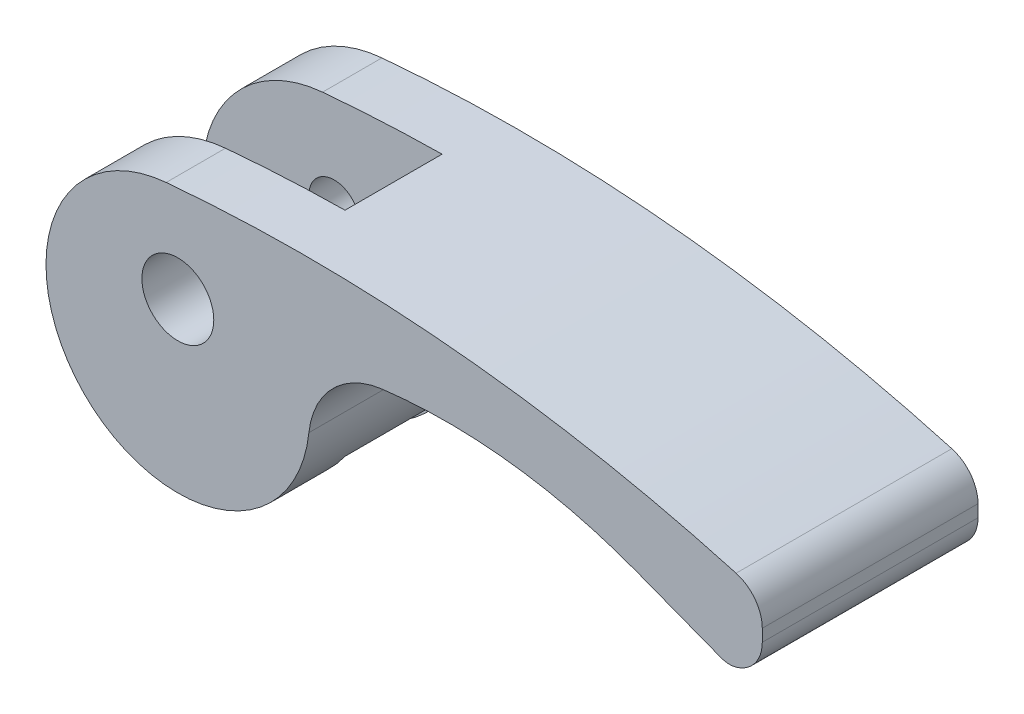
ISO-10303-21;
HEADER;
FILE_DESCRIPTION(('STEP AP214'),'2;1');
FILE_NAME('part.step','',(''),(''),'','','');
FILE_SCHEMA(('AUTOMOTIVE_DESIGN { 1 0 10303 214 1 1 1 1 }'));
ENDSEC;
DATA;
#1=APPLICATION_CONTEXT('core data for automotive mechanical design processes');
#2=APPLICATION_PROTOCOL_DEFINITION('international standard','automotive_design',2000,#1);
#3=PRODUCT_CONTEXT('',#1,'mechanical');
#4=PRODUCT('Part','Part','',(#3));
#5=PRODUCT_RELATED_PRODUCT_CATEGORY('part','',(#4));
#6=PRODUCT_DEFINITION_FORMATION('','',#4);
#7=PRODUCT_DEFINITION_CONTEXT('part definition',#1,'design');
#8=PRODUCT_DEFINITION('design','',#6,#7);
#9=PRODUCT_DEFINITION_SHAPE('','',#8);
#10=(LENGTH_UNIT() NAMED_UNIT(*) SI_UNIT(.MILLI.,.METRE.));
#11=(NAMED_UNIT(*) PLANE_ANGLE_UNIT() SI_UNIT($,.RADIAN.));
#12=(NAMED_UNIT(*) SI_UNIT($,.STERADIAN.) SOLID_ANGLE_UNIT());
#13=UNCERTAINTY_MEASURE_WITH_UNIT(LENGTH_MEASURE(1.E-05),#10,'distance_accuracy_value','');
#14=(GEOMETRIC_REPRESENTATION_CONTEXT(3) GLOBAL_UNCERTAINTY_ASSIGNED_CONTEXT((#13)) GLOBAL_UNIT_ASSIGNED_CONTEXT((#10,
#11,#12)) REPRESENTATION_CONTEXT('',''));
#15=CARTESIAN_POINT('',(0.,0.,0.));
#16=DIRECTION('',(0.,0.,1.));
#17=DIRECTION('',(1.,0.,0.));
#18=AXIS2_PLACEMENT_3D('',#15,#16,#17);
#19=CARTESIAN_POINT('',(0.,0.,18.));
#20=DIRECTION('',(0.,0.,-1.));
#21=DIRECTION('',(-1.,0.,0.));
#22=AXIS2_PLACEMENT_3D('',#19,#20,#21);
#23=CYLINDRICAL_SURFACE('',#22,11.);
#24=CARTESIAN_POINT('',(0.,0.,0.));
#25=DIRECTION('',(0.,0.,1.));
#26=DIRECTION('',(1.,0.,0.));
#27=AXIS2_PLACEMENT_3D('',#24,#25,#26);
#28=CIRCLE('',#27,11.);
#29=CARTESIAN_POINT('',(-0.971178616128908,10.9570439487835,0.));
#30=VERTEX_POINT('',#29);
#31=CARTESIAN_POINT('',(10.9376388184875,-1.16963972073228,0.));
#32=VERTEX_POINT('',#31);
#33=EDGE_CURVE('E177',#30,#32,#28,.T.);
#34=ORIENTED_EDGE('',*,*,#33,.T.);
#35=DIRECTION('',(0.,0.,-1.));
#36=VECTOR('',#35,1.);
#37=CARTESIAN_POINT('',(10.9376388184875,-1.16963972073228,18.));
#38=LINE('',#37,#36);
#39=CARTESIAN_POINT('',(10.9376388184875,-1.16963972073228,18.));
#40=VERTEX_POINT('',#39);
#41=EDGE_CURVE('E50',#32,#40,#38,.F.);
#42=ORIENTED_EDGE('',*,*,#41,.T.);
#43=CARTESIAN_POINT('',(0.,0.,18.));
#44=DIRECTION('',(0.,0.,1.));
#45=DIRECTION('',(1.,0.,0.));
#46=AXIS2_PLACEMENT_3D('',#43,#44,#45);
#47=CIRCLE('',#46,11.);
#48=CARTESIAN_POINT('',(-0.971178616128907,10.9570439487835,18.));
#49=VERTEX_POINT('',#48);
#50=EDGE_CURVE('E196',#49,#40,#47,.T.);
#51=ORIENTED_EDGE('',*,*,#50,.F.);
#52=DIRECTION('',(0.,0.,-1.));
#53=VECTOR('',#52,1.);
#54=CARTESIAN_POINT('',(-0.971178616128908,10.9570439487835,69.1379003460595));
#55=LINE('',#54,#53);
#56=CARTESIAN_POINT('',(-0.971178616128908,10.9570439487835,13.05));
#57=VERTEX_POINT('',#56);
#58=EDGE_CURVE('E127',#49,#57,#55,.T.);
#59=ORIENTED_EDGE('',*,*,#58,.T.);
#60=CARTESIAN_POINT('',(0.,0.,13.05));
#61=DIRECTION('',(0.,0.,1.));
#62=DIRECTION('',(1.,0.,0.));
#63=AXIS2_PLACEMENT_3D('',#60,#61,#62);
#64=CIRCLE('',#63,11.);
#65=CARTESIAN_POINT('',(9.,-6.32455532033675,13.05));
#66=VERTEX_POINT('',#65);
#67=EDGE_CURVE('E123',#57,#66,#64,.T.);
#68=ORIENTED_EDGE('',*,*,#67,.T.);
#69=DIRECTION('',(0.,0.,-1.));
#70=VECTOR('',#69,1.);
#71=CARTESIAN_POINT('',(9.,-6.32455532033675,18.));
#72=LINE('',#71,#70);
#73=CARTESIAN_POINT('',(9.,-6.32455532033675,4.95));
#74=VERTEX_POINT('',#73);
#75=EDGE_CURVE('E125',#66,#74,#72,.T.);
#76=ORIENTED_EDGE('',*,*,#75,.T.);
#77=CARTESIAN_POINT('',(0.,0.,4.95));
#78=DIRECTION('',(0.,0.,-1.));
#79=DIRECTION('',(-1.,0.,0.));
#80=AXIS2_PLACEMENT_3D('',#77,#78,#79);
#81=CIRCLE('',#80,11.);
#82=CARTESIAN_POINT('',(-0.971178616128908,10.9570439487835,4.95));
#83=VERTEX_POINT('',#82);
#84=EDGE_CURVE('E140',#74,#83,#81,.T.);
#85=ORIENTED_EDGE('',*,*,#84,.T.);
#86=EDGE_CURVE('E173',#83,#30,#55,.T.);
#87=ORIENTED_EDGE('',*,*,#86,.T.);
#88=EDGE_LOOP('',(#34,#42,#51,#59,#68,#76,#85,#87));
#89=FACE_BOUND('',#88,.T.);
#90=ADVANCED_FACE('F35',(#89),#23,.T.);
#91=CARTESIAN_POINT('',(0.,0.,18.));
#92=DIRECTION('',(0.,0.,1.));
#93=DIRECTION('',(1.,0.,0.));
#94=AXIS2_PLACEMENT_3D('',#91,#92,#93);
#95=PLANE('',#94);
#96=CARTESIAN_POINT('',(0.,3.,18.));
#97=DIRECTION('',(0.,0.,1.));
#98=DIRECTION('',(1.,0.,0.));
#99=AXIS2_PLACEMENT_3D('',#96,#97,#98);
#100=CIRCLE('',#99,3.);
#101=CARTESIAN_POINT('',(3.,3.,18.));
#102=VERTEX_POINT('',#101);
#103=EDGE_CURVE('E148',#102,#102,#100,.T.);
#104=ORIENTED_EDGE('',*,*,#103,.F.);
#105=EDGE_LOOP('',(#104));
#106=FACE_BOUND('',#105,.T.);
#107=DIRECTION('',(0.933588444724504,-0.358347060650539,0.));
#108=VECTOR('',#107,1.);
#109=CARTESIAN_POINT('',(45.7646997799016,-0.404306450088062,18.));
#110=LINE('',#109,#108);
#111=CARTESIAN_POINT('',(38.3997223191935,2.42265444442153,18.));
#112=VERTEX_POINT('',#111);
#113=CARTESIAN_POINT('',(45.3218152907989,-0.23431039264489,18.));
#114=VERTEX_POINT('',#113);
#115=EDGE_CURVE('E180',#112,#114,#110,.T.);
#116=ORIENTED_EDGE('',*,*,#115,.T.);
#117=CARTESIAN_POINT('',(46.0385094121,1.63286649680412,18.));
#118=DIRECTION('',(0.,0.,1.));
#119=DIRECTION('',(1.,0.,0.));
#120=AXIS2_PLACEMENT_3D('',#117,#118,#119);
#121=CIRCLE('',#120,2.);
#122=CARTESIAN_POINT('',(46.5787627568348,-0.292783088012096,18.));
#123=VERTEX_POINT('',#122);
#124=EDGE_CURVE('E206',#114,#123,#121,.T.);
#125=ORIENTED_EDGE('',*,*,#124,.T.);
#126=CARTESIAN_POINT('',(45.7683827397326,2.59569128921223,18.));
#127=DIRECTION('',(0.,0.,1.));
#128=DIRECTION('',(1.,0.,0.));
#129=AXIS2_PLACEMENT_3D('',#126,#127,#128);
#130=CIRCLE('',#129,3.);
#131=CARTESIAN_POINT('',(48.7683827397326,2.59569128921223,18.));
#132=VERTEX_POINT('',#131);
#133=EDGE_CURVE('E178',#123,#132,#130,.T.);
#134=ORIENTED_EDGE('',*,*,#133,.T.);
#135=DIRECTION('',(0.,1.,0.));
#136=VECTOR('',#135,1.);
#137=CARTESIAN_POINT('',(48.7683827397326,3.61099189827471,18.));
#138=LINE('',#137,#136);
#139=CARTESIAN_POINT('',(48.7683827397326,3.61099189827471,18.));
#140=VERTEX_POINT('',#139);
#141=EDGE_CURVE('E174',#132,#140,#138,.T.);
#142=ORIENTED_EDGE('',*,*,#141,.T.);
#143=CARTESIAN_POINT('',(45.7683827397326,3.61099189827471,18.));
#144=DIRECTION('',(0.,0.,1.));
#145=DIRECTION('',(1.,0.,0.));
#146=AXIS2_PLACEMENT_3D('',#143,#144,#145);
#147=CIRCLE('',#146,3.);
#148=CARTESIAN_POINT('',(46.5841502642035,6.4979493531082,18.));
#149=VERTEX_POINT('',#148);
#150=EDGE_CURVE('E156',#140,#149,#147,.T.);
#151=ORIENTED_EDGE('',*,*,#150,.T.);
#152=CARTESIAN_POINT('',(10.6847820726467,-120.547986548358,18.));
#153=DIRECTION('',(0.,0.,1.));
#154=DIRECTION('',(1.,0.,0.));
#155=AXIS2_PLACEMENT_3D('',#152,#153,#154);
#156=CIRCLE('',#155,132.020583492244);
#157=EDGE_CURVE('E185',#149,#49,#156,.T.);
#158=ORIENTED_EDGE('',*,*,#157,.T.);
#159=ORIENTED_EDGE('',*,*,#50,.T.);
#160=CARTESIAN_POINT('',(17.8979544302523,-1.91395590665283,18.));
#161=DIRECTION('',(0.,0.,1.));
#162=DIRECTION('',(1.,0.,0.));
#163=AXIS2_PLACEMENT_3D('',#160,#161,#162);
#164=CIRCLE('',#163,7.);
#165=CARTESIAN_POINT('',(17.0368113627534,5.03287305462861,18.));
#166=VERTEX_POINT('',#165);
#167=EDGE_CURVE('E11',#40,#166,#164,.F.);
#168=ORIENTED_EDGE('',*,*,#167,.T.);
#169=CARTESIAN_POINT('',(22.4964127558453,-39.009654262856,18.));
#170=DIRECTION('',(0.,0.,1.));
#171=DIRECTION('',(1.,0.,0.));
#172=AXIS2_PLACEMENT_3D('',#169,#170,#171);
#173=CIRCLE('',#172,44.3796288840142);
#174=EDGE_CURVE('E183',#166,#112,#173,.F.);
#175=ORIENTED_EDGE('',*,*,#174,.T.);
#176=EDGE_LOOP('',(#116,#125,#134,#142,#151,#158,#159,#168,#175));
#177=FACE_BOUND('',#176,.T.);
#178=ADVANCED_FACE('F241',(#106,#177),#95,.T.);
#179=CARTESIAN_POINT('',(0.,0.,0.));
#180=DIRECTION('',(0.,0.,1.));
#181=DIRECTION('',(1.,0.,0.));
#182=AXIS2_PLACEMENT_3D('',#179,#180,#181);
#183=PLANE('',#182);
#184=CARTESIAN_POINT('',(0.,3.,0.));
#185=DIRECTION('',(0.,0.,1.));
#186=DIRECTION('',(1.,0.,0.));
#187=AXIS2_PLACEMENT_3D('',#184,#185,#186);
#188=CIRCLE('',#187,2.1);
#189=CARTESIAN_POINT('',(2.1,3.,0.));
#190=VERTEX_POINT('',#189);
#191=EDGE_CURVE('E218',#190,#190,#188,.T.);
#192=ORIENTED_EDGE('',*,*,#191,.T.);
#193=EDGE_LOOP('',(#192));
#194=FACE_BOUND('',#193,.T.);
#195=CARTESIAN_POINT('',(45.7683827397326,2.59569128921223,0.));
#196=DIRECTION('',(0.,0.,1.));
#197=DIRECTION('',(-1.,0.,0.));
#198=AXIS2_PLACEMENT_3D('',#195,#196,#197);
#199=CIRCLE('',#198,3.);
#200=CARTESIAN_POINT('',(46.5787627568348,-0.292783088012096,0.));
#201=VERTEX_POINT('',#200);
#202=CARTESIAN_POINT('',(48.7683827397326,2.59569128921223,0.));
#203=VERTEX_POINT('',#202);
#204=EDGE_CURVE('E162',#201,#203,#199,.T.);
#205=ORIENTED_EDGE('',*,*,#204,.F.);
#206=CARTESIAN_POINT('',(46.0385094121,1.63286649680412,0.));
#207=DIRECTION('',(0.,0.,1.));
#208=DIRECTION('',(1.,0.,0.));
#209=AXIS2_PLACEMENT_3D('',#206,#207,#208);
#210=CIRCLE('',#209,2.);
#211=CARTESIAN_POINT('',(45.3218152907989,-0.23431039264489,0.));
#212=VERTEX_POINT('',#211);
#213=EDGE_CURVE('E202',#201,#212,#210,.F.);
#214=ORIENTED_EDGE('',*,*,#213,.T.);
#215=DIRECTION('',(0.933588444724504,-0.358347060650539,0.));
#216=VECTOR('',#215,1.);
#217=CARTESIAN_POINT('',(45.7646997799016,-0.404306450088062,0.));
#218=LINE('',#217,#216);
#219=CARTESIAN_POINT('',(38.3997223191935,2.42265444442153,0.));
#220=VERTEX_POINT('',#219);
#221=EDGE_CURVE('E164',#220,#212,#218,.T.);
#222=ORIENTED_EDGE('',*,*,#221,.F.);
#223=CARTESIAN_POINT('',(22.4964127558453,-39.009654262856,0.));
#224=DIRECTION('',(0.,0.,-1.));
#225=DIRECTION('',(-1.,0.,0.));
#226=AXIS2_PLACEMENT_3D('',#223,#224,#225);
#227=CIRCLE('',#226,44.3796288840142);
#228=CARTESIAN_POINT('',(17.0368113627534,5.03287305462861,0.));
#229=VERTEX_POINT('',#228);
#230=EDGE_CURVE('E168',#229,#220,#227,.T.);
#231=ORIENTED_EDGE('',*,*,#230,.F.);
#232=CARTESIAN_POINT('',(17.8979544302523,-1.91395590665283,0.));
#233=DIRECTION('',(0.,0.,1.));
#234=DIRECTION('',(1.,0.,0.));
#235=AXIS2_PLACEMENT_3D('',#232,#233,#234);
#236=CIRCLE('',#235,7.);
#237=EDGE_CURVE('E43',#229,#32,#236,.T.);
#238=ORIENTED_EDGE('',*,*,#237,.T.);
#239=ORIENTED_EDGE('',*,*,#33,.F.);
#240=CARTESIAN_POINT('',(10.6847820726467,-120.547986548358,0.));
#241=DIRECTION('',(0.,0.,1.));
#242=DIRECTION('',(-1.,0.,0.));
#243=AXIS2_PLACEMENT_3D('',#240,#241,#242);
#244=CIRCLE('',#243,132.020583492244);
#245=CARTESIAN_POINT('',(46.5841502642035,6.4979493531082,0.));
#246=VERTEX_POINT('',#245);
#247=EDGE_CURVE('E170',#246,#30,#244,.T.);
#248=ORIENTED_EDGE('',*,*,#247,.F.);
#249=CARTESIAN_POINT('',(45.7683827397326,3.61099189827471,0.));
#250=DIRECTION('',(0.,0.,1.));
#251=DIRECTION('',(-1.,0.,0.));
#252=AXIS2_PLACEMENT_3D('',#249,#250,#251);
#253=CIRCLE('',#252,3.);
#254=CARTESIAN_POINT('',(48.7683827397326,3.61099189827471,0.));
#255=VERTEX_POINT('',#254);
#256=EDGE_CURVE('E153',#255,#246,#253,.T.);
#257=ORIENTED_EDGE('',*,*,#256,.F.);
#258=DIRECTION('',(0.,1.,0.));
#259=VECTOR('',#258,1.);
#260=CARTESIAN_POINT('',(48.7683827397326,3.61099189827471,0.));
#261=LINE('',#260,#259);
#262=EDGE_CURVE('E158',#203,#255,#261,.T.);
#263=ORIENTED_EDGE('',*,*,#262,.F.);
#264=EDGE_LOOP('',(#205,#214,#222,#231,#238,#239,#248,#257,#263));
#265=FACE_BOUND('',#264,.T.);
#266=ADVANCED_FACE('F230',(#194,#265),#183,.F.);
#267=CARTESIAN_POINT('',(10.6847820726467,-120.547986548358,69.1379003460595));
#268=DIRECTION('',(0.,0.,-1.));
#269=DIRECTION('',(-1.,0.,0.));
#270=AXIS2_PLACEMENT_3D('',#267,#268,#269);
#271=CYLINDRICAL_SURFACE('',#270,132.020583492244);
#272=ORIENTED_EDGE('',*,*,#86,.F.);
#273=CARTESIAN_POINT('',(10.6847820726467,-120.547986548358,4.95));
#274=DIRECTION('',(0.,0.,-1.));
#275=DIRECTION('',(-1.,0.,0.));
#276=AXIS2_PLACEMENT_3D('',#273,#274,#275);
#277=CIRCLE('',#276,132.020583492244);
#278=CARTESIAN_POINT('',(9.,11.4618463240462,4.95));
#279=VERTEX_POINT('',#278);
#280=EDGE_CURVE('E211',#83,#279,#277,.T.);
#281=ORIENTED_EDGE('',*,*,#280,.T.);
#282=DIRECTION('',(0.,0.,-1.));
#283=VECTOR('',#282,1.);
#284=CARTESIAN_POINT('',(9.,11.4618463240462,69.1379003460595));
#285=LINE('',#284,#283);
#286=CARTESIAN_POINT('',(9.,11.4618463240462,13.05));
#287=VERTEX_POINT('',#286);
#288=EDGE_CURVE('E209',#279,#287,#285,.F.);
#289=ORIENTED_EDGE('',*,*,#288,.T.);
#290=CARTESIAN_POINT('',(10.6847820726467,-120.547986548358,13.05));
#291=DIRECTION('',(0.,0.,1.));
#292=DIRECTION('',(1.,0.,0.));
#293=AXIS2_PLACEMENT_3D('',#290,#291,#292);
#294=CIRCLE('',#293,132.020583492244);
#295=EDGE_CURVE('E143',#287,#57,#294,.T.);
#296=ORIENTED_EDGE('',*,*,#295,.T.);
#297=ORIENTED_EDGE('',*,*,#58,.F.);
#298=ORIENTED_EDGE('',*,*,#157,.F.);
#299=DIRECTION('',(0.,0.,-1.));
#300=VECTOR('',#299,1.);
#301=CARTESIAN_POINT('',(46.5841502642035,6.4979493531082,69.1379003460595));
#302=LINE('',#301,#300);
#303=EDGE_CURVE('E152',#149,#246,#302,.T.);
#304=ORIENTED_EDGE('',*,*,#303,.T.);
#305=ORIENTED_EDGE('',*,*,#247,.T.);
#306=EDGE_LOOP('',(#272,#281,#289,#296,#297,#298,#304,#305));
#307=FACE_BOUND('',#306,.T.);
#308=ADVANCED_FACE('F257',(#307),#271,.T.);
#309=CARTESIAN_POINT('',(22.4964127558453,-39.009654262856,69.1379003460595));
#310=DIRECTION('',(0.,0.,-1.));
#311=DIRECTION('',(-1.,0.,0.));
#312=AXIS2_PLACEMENT_3D('',#309,#310,#311);
#313=CYLINDRICAL_SURFACE('',#312,44.3796288840142);
#314=ORIENTED_EDGE('',*,*,#174,.F.);
#315=DIRECTION('',(0.,0.,-1.));
#316=VECTOR('',#315,1.);
#317=CARTESIAN_POINT('',(17.0368113627534,5.03287305462862,69.1379003460595));
#318=LINE('',#317,#316);
#319=EDGE_CURVE('E214',#166,#229,#318,.T.);
#320=ORIENTED_EDGE('',*,*,#319,.T.);
#321=ORIENTED_EDGE('',*,*,#230,.T.);
#322=DIRECTION('',(0.,0.,-1.));
#323=VECTOR('',#322,1.);
#324=CARTESIAN_POINT('',(38.3997223191935,2.42265444442153,69.1379003460595));
#325=LINE('',#324,#323);
#326=EDGE_CURVE('E167',#112,#220,#325,.T.);
#327=ORIENTED_EDGE('',*,*,#326,.F.);
#328=EDGE_LOOP('',(#314,#320,#321,#327));
#329=FACE_BOUND('',#328,.T.);
#330=ADVANCED_FACE('F224',(#329),#313,.F.);
#331=CARTESIAN_POINT('',(45.7646997799016,-0.404306450088062,69.1379003460595));
#332=DIRECTION('',(0.358347060650539,0.933588444724504,0.));
#333=DIRECTION('',(-0.933588444724504,0.358347060650539,0.));
#334=AXIS2_PLACEMENT_3D('',#331,#332,#333);
#335=PLANE('',#334);
#336=ORIENTED_EDGE('',*,*,#221,.T.);
#337=DIRECTION('',(0.,0.,-1.));
#338=VECTOR('',#337,1.);
#339=CARTESIAN_POINT('',(45.3218152907989,-0.23431039264489,69.1379003460595));
#340=LINE('',#339,#338);
#341=EDGE_CURVE('E204',#212,#114,#340,.F.);
#342=ORIENTED_EDGE('',*,*,#341,.T.);
#343=ORIENTED_EDGE('',*,*,#115,.F.);
#344=ORIENTED_EDGE('',*,*,#326,.T.);
#345=EDGE_LOOP('',(#336,#342,#343,#344));
#346=FACE_BOUND('',#345,.T.);
#347=ADVANCED_FACE('F233',(#346),#335,.F.);
#348=CARTESIAN_POINT('',(45.7683827397326,2.59569128921223,69.1379003460595));
#349=DIRECTION('',(0.,0.,-1.));
#350=DIRECTION('',(-1.,0.,0.));
#351=AXIS2_PLACEMENT_3D('',#348,#349,#350);
#352=CYLINDRICAL_SURFACE('',#351,3.);
#353=ORIENTED_EDGE('',*,*,#133,.F.);
#354=DIRECTION('',(0.,0.,-1.));
#355=VECTOR('',#354,1.);
#356=CARTESIAN_POINT('',(46.5787627568348,-0.292783088012096,69.1379003460595));
#357=LINE('',#356,#355);
#358=EDGE_CURVE('E198',#123,#201,#357,.T.);
#359=ORIENTED_EDGE('',*,*,#358,.T.);
#360=ORIENTED_EDGE('',*,*,#204,.T.);
#361=DIRECTION('',(0.,0.,-1.));
#362=VECTOR('',#361,1.);
#363=CARTESIAN_POINT('',(48.7683827397326,2.59569128921223,69.1379003460595));
#364=LINE('',#363,#362);
#365=EDGE_CURVE('E161',#132,#203,#364,.T.);
#366=ORIENTED_EDGE('',*,*,#365,.F.);
#367=EDGE_LOOP('',(#353,#359,#360,#366));
#368=FACE_BOUND('',#367,.T.);
#369=ADVANCED_FACE('F245',(#368),#352,.T.);
#370=CARTESIAN_POINT('',(48.7683827397326,3.61099189827471,69.1379003460595));
#371=DIRECTION('',(-1.,0.,0.));
#372=DIRECTION('',(0.,0.,1.));
#373=AXIS2_PLACEMENT_3D('',#370,#371,#372);
#374=PLANE('',#373);
#375=ORIENTED_EDGE('',*,*,#141,.F.);
#376=ORIENTED_EDGE('',*,*,#365,.T.);
#377=ORIENTED_EDGE('',*,*,#262,.T.);
#378=DIRECTION('',(0.,0.,-1.));
#379=VECTOR('',#378,1.);
#380=CARTESIAN_POINT('',(48.7683827397326,3.61099189827471,69.1379003460595));
#381=LINE('',#380,#379);
#382=EDGE_CURVE('E157',#140,#255,#381,.T.);
#383=ORIENTED_EDGE('',*,*,#382,.F.);
#384=EDGE_LOOP('',(#375,#376,#377,#383));
#385=FACE_BOUND('',#384,.T.);
#386=ADVANCED_FACE('F248',(#385),#374,.F.);
#387=CARTESIAN_POINT('',(45.7683827397326,3.61099189827471,69.1379003460595));
#388=DIRECTION('',(0.,0.,-1.));
#389=DIRECTION('',(-1.,0.,0.));
#390=AXIS2_PLACEMENT_3D('',#387,#388,#389);
#391=CYLINDRICAL_SURFACE('',#390,3.);
#392=ORIENTED_EDGE('',*,*,#150,.F.);
#393=ORIENTED_EDGE('',*,*,#382,.T.);
#394=ORIENTED_EDGE('',*,*,#256,.T.);
#395=ORIENTED_EDGE('',*,*,#303,.F.);
#396=EDGE_LOOP('',(#392,#393,#394,#395));
#397=FACE_BOUND('',#396,.T.);
#398=ADVANCED_FACE('F253',(#397),#391,.T.);
#399=CARTESIAN_POINT('',(46.0385094121,1.63286649680412,69.1379003460595));
#400=DIRECTION('',(0.,0.,-1.));
#401=DIRECTION('',(-1.,0.,0.));
#402=AXIS2_PLACEMENT_3D('',#399,#400,#401);
#403=CYLINDRICAL_SURFACE('',#402,2.);
#404=ORIENTED_EDGE('',*,*,#124,.F.);
#405=ORIENTED_EDGE('',*,*,#341,.F.);
#406=ORIENTED_EDGE('',*,*,#213,.F.);
#407=ORIENTED_EDGE('',*,*,#358,.F.);
#408=EDGE_LOOP('',(#404,#405,#406,#407));
#409=FACE_BOUND('',#408,.T.);
#410=ADVANCED_FACE('F237',(#409),#403,.T.);
#411=CARTESIAN_POINT('',(-11.,-11.,4.95));
#412=DIRECTION('',(0.,0.,-1.));
#413=DIRECTION('',(-1.,0.,0.));
#414=AXIS2_PLACEMENT_3D('',#411,#412,#413);
#415=PLANE('',#414);
#416=CARTESIAN_POINT('',(0.,3.,4.95));
#417=DIRECTION('',(0.,0.,-1.));
#418=DIRECTION('',(-1.,0.,0.));
#419=AXIS2_PLACEMENT_3D('',#416,#417,#418);
#420=CIRCLE('',#419,2.1);
#421=CARTESIAN_POINT('',(-2.1,3.,4.95));
#422=VERTEX_POINT('',#421);
#423=EDGE_CURVE('E215',#422,#422,#420,.T.);
#424=ORIENTED_EDGE('',*,*,#423,.T.);
#425=EDGE_LOOP('',(#424));
#426=FACE_BOUND('',#425,.T.);
#427=DIRECTION('',(0.,1.,0.));
#428=VECTOR('',#427,1.);
#429=CARTESIAN_POINT('',(9.,-11.,4.95));
#430=LINE('',#429,#428);
#431=EDGE_CURVE('E131',#74,#279,#430,.T.);
#432=ORIENTED_EDGE('',*,*,#431,.T.);
#433=ORIENTED_EDGE('',*,*,#280,.F.);
#434=ORIENTED_EDGE('',*,*,#84,.F.);
#435=EDGE_LOOP('',(#432,#433,#434));
#436=FACE_BOUND('',#435,.T.);
#437=ADVANCED_FACE('F260',(#426,#436),#415,.F.);
#438=CARTESIAN_POINT('',(9.,-11.,13.05));
#439=DIRECTION('',(1.,0.,0.));
#440=DIRECTION('',(0.,0.,-1.));
#441=AXIS2_PLACEMENT_3D('',#438,#439,#440);
#442=PLANE('',#441);
#443=DIRECTION('',(0.,1.,0.));
#444=VECTOR('',#443,1.);
#445=CARTESIAN_POINT('',(9.,-11.,13.05));
#446=LINE('',#445,#444);
#447=EDGE_CURVE('E137',#66,#287,#446,.T.);
#448=ORIENTED_EDGE('',*,*,#447,.T.);
#449=ORIENTED_EDGE('',*,*,#288,.F.);
#450=ORIENTED_EDGE('',*,*,#431,.F.);
#451=ORIENTED_EDGE('',*,*,#75,.F.);
#452=EDGE_LOOP('',(#448,#449,#450,#451));
#453=FACE_BOUND('',#452,.T.);
#454=ADVANCED_FACE('F136',(#453),#442,.F.);
#455=CARTESIAN_POINT('',(-11.,-11.,13.05));
#456=DIRECTION('',(0.,0.,1.));
#457=DIRECTION('',(1.,0.,0.));
#458=AXIS2_PLACEMENT_3D('',#455,#456,#457);
#459=PLANE('',#458);
#460=CARTESIAN_POINT('',(0.,3.,13.05));
#461=DIRECTION('',(0.,0.,1.));
#462=DIRECTION('',(1.,0.,0.));
#463=AXIS2_PLACEMENT_3D('',#460,#461,#462);
#464=CIRCLE('',#463,3.);
#465=CARTESIAN_POINT('',(3.,3.,13.05));
#466=VERTEX_POINT('',#465);
#467=EDGE_CURVE('E144',#466,#466,#464,.F.);
#468=ORIENTED_EDGE('',*,*,#467,.F.);
#469=EDGE_LOOP('',(#468));
#470=FACE_BOUND('',#469,.T.);
#471=ORIENTED_EDGE('',*,*,#67,.F.);
#472=ORIENTED_EDGE('',*,*,#295,.F.);
#473=ORIENTED_EDGE('',*,*,#447,.F.);
#474=EDGE_LOOP('',(#471,#472,#473));
#475=FACE_BOUND('',#474,.T.);
#476=ADVANCED_FACE('F142',(#470,#475),#459,.F.);
#477=CARTESIAN_POINT('',(0.,3.,4.56471862576143));
#478=DIRECTION('',(0.,0.,1.));
#479=DIRECTION('',(1.,0.,0.));
#480=AXIS2_PLACEMENT_3D('',#477,#478,#479);
#481=CYLINDRICAL_SURFACE('',#480,3.);
#482=ORIENTED_EDGE('',*,*,#467,.T.);
#483=EDGE_LOOP('',(#482));
#484=FACE_BOUND('',#483,.T.);
#485=ORIENTED_EDGE('',*,*,#103,.T.);
#486=EDGE_LOOP('',(#485));
#487=FACE_BOUND('',#486,.T.);
#488=ADVANCED_FACE('F266',(#484,#487),#481,.F.);
#489=CARTESIAN_POINT('',(0.,3.,0.));
#490=DIRECTION('',(0.,0.,1.));
#491=DIRECTION('',(1.,0.,0.));
#492=AXIS2_PLACEMENT_3D('',#489,#490,#491);
#493=CYLINDRICAL_SURFACE('',#492,2.1);
#494=ORIENTED_EDGE('',*,*,#191,.F.);
#495=EDGE_LOOP('',(#494));
#496=FACE_BOUND('',#495,.T.);
#497=ORIENTED_EDGE('',*,*,#423,.F.);
#498=EDGE_LOOP('',(#497));
#499=FACE_BOUND('',#498,.T.);
#500=ADVANCED_FACE('F262',(#496,#499),#493,.F.);
#501=CARTESIAN_POINT('',(17.8979544302523,-1.91395590665283,18.));
#502=DIRECTION('',(0.,0.,-1.));
#503=DIRECTION('',(-1.,0.,0.));
#504=AXIS2_PLACEMENT_3D('',#501,#502,#503);
#505=CYLINDRICAL_SURFACE('',#504,7.);
#506=ORIENTED_EDGE('',*,*,#167,.F.);
#507=ORIENTED_EDGE('',*,*,#41,.F.);
#508=ORIENTED_EDGE('',*,*,#237,.F.);
#509=ORIENTED_EDGE('',*,*,#319,.F.);
#510=EDGE_LOOP('',(#506,#507,#508,#509));
#511=FACE_BOUND('',#510,.T.);
#512=ADVANCED_FACE('F37',(#511),#505,.F.);
#513=CLOSED_SHELL('',(#90,#178,#266,#308,#330,#347,#369,#386,#398,#410,#437,#454,#476,#488,#500,#512));
#514=MANIFOLD_SOLID_BREP('B2',#513);
#515=ADVANCED_BREP_SHAPE_REPRESENTATION('',(#18,#514),#14);
#516=SHAPE_DEFINITION_REPRESENTATION(#9,#515);
ENDSEC;
END-ISO-10303-21;
